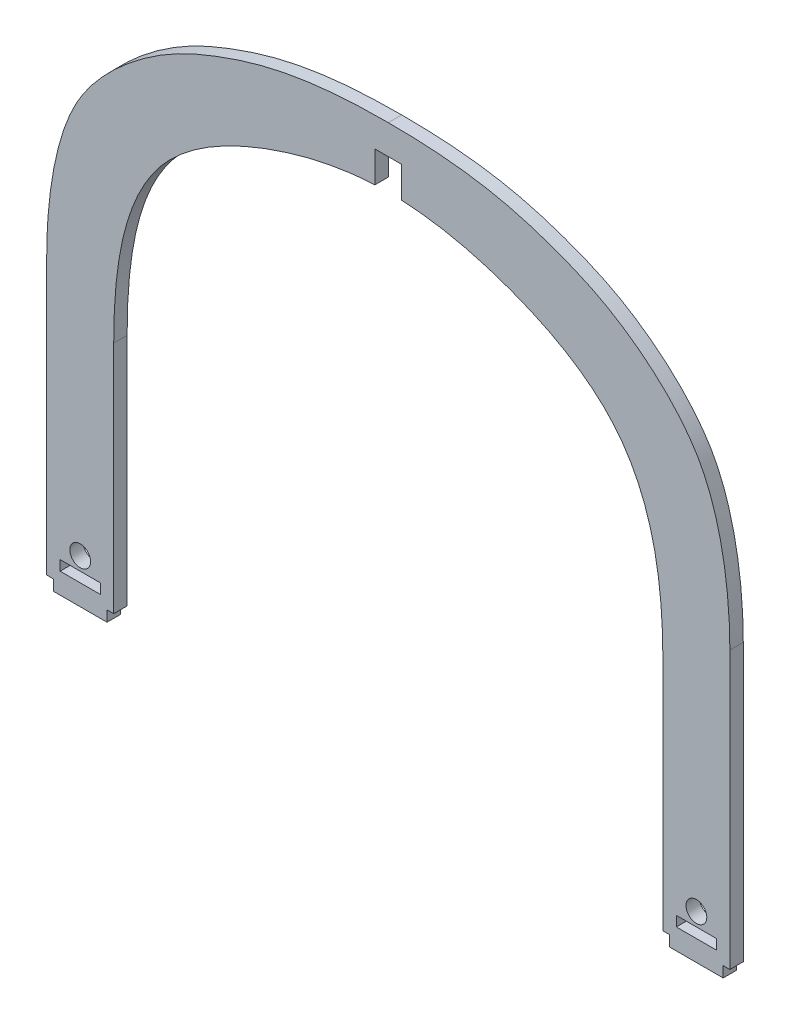
ISO-10303-21;
HEADER;
FILE_DESCRIPTION(('STEP AP214'),'2;1');
FILE_NAME('part.step','',(''),(''),'','','');
FILE_SCHEMA(('AUTOMOTIVE_DESIGN { 1 0 10303 214 1 1 1 1 }'));
ENDSEC;
DATA;
#1=APPLICATION_CONTEXT('core data for automotive mechanical design processes');
#2=APPLICATION_PROTOCOL_DEFINITION('international standard','automotive_design',2000,#1);
#3=PRODUCT_CONTEXT('',#1,'mechanical');
#4=PRODUCT('Part','Part','',(#3));
#5=PRODUCT_RELATED_PRODUCT_CATEGORY('part','',(#4));
#6=PRODUCT_DEFINITION_FORMATION('','',#4);
#7=PRODUCT_DEFINITION_CONTEXT('part definition',#1,'design');
#8=PRODUCT_DEFINITION('design','',#6,#7);
#9=PRODUCT_DEFINITION_SHAPE('','',#8);
#10=(LENGTH_UNIT() NAMED_UNIT(*) SI_UNIT(.MILLI.,.METRE.));
#11=(NAMED_UNIT(*) PLANE_ANGLE_UNIT() SI_UNIT($,.RADIAN.));
#12=(NAMED_UNIT(*) SI_UNIT($,.STERADIAN.) SOLID_ANGLE_UNIT());
#13=UNCERTAINTY_MEASURE_WITH_UNIT(LENGTH_MEASURE(1.E-05),#10,'distance_accuracy_value','');
#14=(GEOMETRIC_REPRESENTATION_CONTEXT(3) GLOBAL_UNCERTAINTY_ASSIGNED_CONTEXT((#13)) GLOBAL_UNIT_ASSIGNED_CONTEXT((#10,
#11,#12)) REPRESENTATION_CONTEXT('',''));
#15=CARTESIAN_POINT('',(0.,0.,0.));
#16=DIRECTION('',(0.,0.,1.));
#17=DIRECTION('',(1.,0.,0.));
#18=AXIS2_PLACEMENT_3D('',#15,#16,#17);
#19=CARTESIAN_POINT('',(0.,0.,2.));
#20=DIRECTION('',(1.,0.,0.));
#21=DIRECTION('',(0.,0.,-1.));
#22=AXIS2_PLACEMENT_3D('',#19,#20,#21);
#23=PLANE('',#22);
#24=DIRECTION('',(0.,-1.,0.));
#25=VECTOR('',#24,1.);
#26=CARTESIAN_POINT('',(0.,0.,0.));
#27=LINE('',#26,#25);
#28=CARTESIAN_POINT('',(0.,41.3187023405494,0.));
#29=VERTEX_POINT('',#28);
#30=CARTESIAN_POINT('',(0.,0.,0.));
#31=VERTEX_POINT('',#30);
#32=EDGE_CURVE('E334',#29,#31,#27,.T.);
#33=ORIENTED_EDGE('',*,*,#32,.T.);
#34=DIRECTION('',(0.,0.,-1.));
#35=VECTOR('',#34,1.);
#36=CARTESIAN_POINT('',(0.,0.,2.));
#37=LINE('',#36,#35);
#38=CARTESIAN_POINT('',(0.,0.,2.));
#39=VERTEX_POINT('',#38);
#40=EDGE_CURVE('E44',#39,#31,#37,.T.);
#41=ORIENTED_EDGE('',*,*,#40,.F.);
#42=DIRECTION('',(0.,-1.,0.));
#43=VECTOR('',#42,1.);
#44=CARTESIAN_POINT('',(0.,0.,2.));
#45=LINE('',#44,#43);
#46=CARTESIAN_POINT('',(0.,41.3187023405494,2.));
#47=VERTEX_POINT('',#46);
#48=EDGE_CURVE('E335',#47,#39,#45,.T.);
#49=ORIENTED_EDGE('',*,*,#48,.F.);
#50=DIRECTION('',(0.,0.,-1.));
#51=VECTOR('',#50,1.);
#52=CARTESIAN_POINT('',(0.,41.3187023405494,2.));
#53=LINE('',#52,#51);
#54=EDGE_CURVE('E470',#47,#29,#53,.T.);
#55=ORIENTED_EDGE('',*,*,#54,.T.);
#56=EDGE_LOOP('',(#33,#41,#49,#55));
#57=FACE_BOUND('',#56,.T.);
#58=ADVANCED_FACE('F37',(#57),#23,.F.);
#59=CARTESIAN_POINT('',(0.,0.,2.));
#60=DIRECTION('',(0.,1.,0.));
#61=DIRECTION('',(0.,0.,1.));
#62=AXIS2_PLACEMENT_3D('',#59,#60,#61);
#63=PLANE('',#62);
#64=DIRECTION('',(1.,0.,0.));
#65=VECTOR('',#64,1.);
#66=CARTESIAN_POINT('',(0.,0.,0.));
#67=LINE('',#66,#65);
#68=CARTESIAN_POINT('',(0.999999999999987,0.,0.));
#69=VERTEX_POINT('',#68);
#70=EDGE_CURVE('E401',#31,#69,#67,.T.);
#71=ORIENTED_EDGE('',*,*,#70,.T.);
#72=DIRECTION('',(0.,0.,-1.));
#73=VECTOR('',#72,1.);
#74=CARTESIAN_POINT('',(0.999999999999987,0.,2.));
#75=LINE('',#74,#73);
#76=CARTESIAN_POINT('',(0.999999999999987,0.,2.));
#77=VERTEX_POINT('',#76);
#78=EDGE_CURVE('E403',#77,#69,#75,.T.);
#79=ORIENTED_EDGE('',*,*,#78,.F.);
#80=DIRECTION('',(1.,0.,0.));
#81=VECTOR('',#80,1.);
#82=CARTESIAN_POINT('',(0.,0.,2.));
#83=LINE('',#82,#81);
#84=EDGE_CURVE('E338',#39,#77,#83,.T.);
#85=ORIENTED_EDGE('',*,*,#84,.F.);
#86=ORIENTED_EDGE('',*,*,#40,.T.);
#87=EDGE_LOOP('',(#71,#79,#85,#86));
#88=FACE_BOUND('',#87,.T.);
#89=ADVANCED_FACE('F391',(#88),#63,.F.);
#90=CARTESIAN_POINT('',(0.999999999999987,-1.6,2.));
#91=DIRECTION('',(1.,0.,0.));
#92=DIRECTION('',(0.,0.,-1.));
#93=AXIS2_PLACEMENT_3D('',#90,#91,#92);
#94=PLANE('',#93);
#95=DIRECTION('',(0.,-1.,0.));
#96=VECTOR('',#95,1.);
#97=CARTESIAN_POINT('',(0.999999999999987,-1.6,0.));
#98=LINE('',#97,#96);
#99=CARTESIAN_POINT('',(0.999999999999987,-1.6,0.));
#100=VERTEX_POINT('',#99);
#101=EDGE_CURVE('E410',#69,#100,#98,.T.);
#102=ORIENTED_EDGE('',*,*,#101,.T.);
#103=DIRECTION('',(0.,0.,-1.));
#104=VECTOR('',#103,1.);
#105=CARTESIAN_POINT('',(0.999999999999987,-1.6,2.));
#106=LINE('',#105,#104);
#107=CARTESIAN_POINT('',(0.999999999999987,-1.6,2.));
#108=VERTEX_POINT('',#107);
#109=EDGE_CURVE('E414',#108,#100,#106,.T.);
#110=ORIENTED_EDGE('',*,*,#109,.F.);
#111=DIRECTION('',(0.,-1.,0.));
#112=VECTOR('',#111,1.);
#113=CARTESIAN_POINT('',(0.999999999999987,-1.6,2.));
#114=LINE('',#113,#112);
#115=EDGE_CURVE('E341',#77,#108,#114,.T.);
#116=ORIENTED_EDGE('',*,*,#115,.F.);
#117=ORIENTED_EDGE('',*,*,#78,.T.);
#118=EDGE_LOOP('',(#102,#110,#116,#117));
#119=FACE_BOUND('',#118,.T.);
#120=ADVANCED_FACE('F388',(#119),#94,.F.);
#121=CARTESIAN_POINT('',(8.99999999999999,-1.6,2.));
#122=DIRECTION('',(0.,1.,0.));
#123=DIRECTION('',(0.,0.,1.));
#124=AXIS2_PLACEMENT_3D('',#121,#122,#123);
#125=PLANE('',#124);
#126=DIRECTION('',(1.,0.,0.));
#127=VECTOR('',#126,1.);
#128=CARTESIAN_POINT('',(8.99999999999999,-1.6,0.));
#129=LINE('',#128,#127);
#130=CARTESIAN_POINT('',(8.99999999999999,-1.6,0.));
#131=VERTEX_POINT('',#130);
#132=EDGE_CURVE('E420',#100,#131,#129,.T.);
#133=ORIENTED_EDGE('',*,*,#132,.T.);
#134=DIRECTION('',(0.,0.,-1.));
#135=VECTOR('',#134,1.);
#136=CARTESIAN_POINT('',(8.99999999999999,-1.6,2.));
#137=LINE('',#136,#135);
#138=CARTESIAN_POINT('',(8.99999999999999,-1.6,2.));
#139=VERTEX_POINT('',#138);
#140=EDGE_CURVE('E513',#139,#131,#137,.T.);
#141=ORIENTED_EDGE('',*,*,#140,.F.);
#142=DIRECTION('',(1.,0.,0.));
#143=VECTOR('',#142,1.);
#144=CARTESIAN_POINT('',(8.99999999999999,-1.6,2.));
#145=LINE('',#144,#143);
#146=EDGE_CURVE('E343',#108,#139,#145,.T.);
#147=ORIENTED_EDGE('',*,*,#146,.F.);
#148=ORIENTED_EDGE('',*,*,#109,.T.);
#149=EDGE_LOOP('',(#133,#141,#147,#148));
#150=FACE_BOUND('',#149,.T.);
#151=ADVANCED_FACE('F384',(#150),#125,.F.);
#152=CARTESIAN_POINT('',(8.99999999999999,-1.6,2.));
#153=DIRECTION('',(-1.,0.,0.));
#154=DIRECTION('',(0.,0.,1.));
#155=AXIS2_PLACEMENT_3D('',#152,#153,#154);
#156=PLANE('',#155);
#157=DIRECTION('',(0.,1.,0.));
#158=VECTOR('',#157,1.);
#159=CARTESIAN_POINT('',(8.99999999999999,-1.6,0.));
#160=LINE('',#159,#158);
#161=CARTESIAN_POINT('',(8.99999999999999,0.,0.));
#162=VERTEX_POINT('',#161);
#163=EDGE_CURVE('E422',#131,#162,#160,.T.);
#164=ORIENTED_EDGE('',*,*,#163,.T.);
#165=DIRECTION('',(0.,0.,-1.));
#166=VECTOR('',#165,1.);
#167=CARTESIAN_POINT('',(8.99999999999999,0.,2.));
#168=LINE('',#167,#166);
#169=CARTESIAN_POINT('',(8.99999999999999,0.,2.));
#170=VERTEX_POINT('',#169);
#171=EDGE_CURVE('E510',#170,#162,#168,.T.);
#172=ORIENTED_EDGE('',*,*,#171,.F.);
#173=DIRECTION('',(0.,1.,0.));
#174=VECTOR('',#173,1.);
#175=CARTESIAN_POINT('',(8.99999999999999,-1.6,2.));
#176=LINE('',#175,#174);
#177=EDGE_CURVE('E345',#139,#170,#176,.T.);
#178=ORIENTED_EDGE('',*,*,#177,.F.);
#179=ORIENTED_EDGE('',*,*,#140,.T.);
#180=EDGE_LOOP('',(#164,#172,#178,#179));
#181=FACE_BOUND('',#180,.T.);
#182=ADVANCED_FACE('F380',(#181),#156,.F.);
#183=CARTESIAN_POINT('',(8.99999999999999,0.,2.));
#184=DIRECTION('',(0.,1.,0.));
#185=DIRECTION('',(0.,0.,1.));
#186=AXIS2_PLACEMENT_3D('',#183,#184,#185);
#187=PLANE('',#186);
#188=DIRECTION('',(1.,0.,0.));
#189=VECTOR('',#188,1.);
#190=CARTESIAN_POINT('',(8.99999999999999,0.,0.));
#191=LINE('',#190,#189);
#192=CARTESIAN_POINT('',(10.,0.,0.));
#193=VERTEX_POINT('',#192);
#194=EDGE_CURVE('E427',#162,#193,#191,.T.);
#195=ORIENTED_EDGE('',*,*,#194,.T.);
#196=DIRECTION('',(0.,0.,-1.));
#197=VECTOR('',#196,1.);
#198=CARTESIAN_POINT('',(10.,0.,2.));
#199=LINE('',#198,#197);
#200=CARTESIAN_POINT('',(10.,0.,2.));
#201=VERTEX_POINT('',#200);
#202=EDGE_CURVE('E507',#201,#193,#199,.T.);
#203=ORIENTED_EDGE('',*,*,#202,.F.);
#204=DIRECTION('',(1.,0.,0.));
#205=VECTOR('',#204,1.);
#206=CARTESIAN_POINT('',(8.99999999999999,0.,2.));
#207=LINE('',#206,#205);
#208=EDGE_CURVE('E347',#170,#201,#207,.T.);
#209=ORIENTED_EDGE('',*,*,#208,.F.);
#210=ORIENTED_EDGE('',*,*,#171,.T.);
#211=EDGE_LOOP('',(#195,#203,#209,#210));
#212=FACE_BOUND('',#211,.T.);
#213=ADVANCED_FACE('F376',(#212),#187,.F.);
#214=CARTESIAN_POINT('',(10.,0.,2.));
#215=DIRECTION('',(-1.,0.,0.));
#216=DIRECTION('',(0.,0.,1.));
#217=AXIS2_PLACEMENT_3D('',#214,#215,#216);
#218=PLANE('',#217);
#219=DIRECTION('',(0.,1.,0.));
#220=VECTOR('',#219,1.);
#221=CARTESIAN_POINT('',(10.,0.,0.));
#222=LINE('',#221,#220);
#223=CARTESIAN_POINT('',(10.,35.,0.));
#224=VERTEX_POINT('',#223);
#225=EDGE_CURVE('E429',#193,#224,#222,.T.);
#226=ORIENTED_EDGE('',*,*,#225,.T.);
#227=DIRECTION('',(0.,0.,-1.));
#228=VECTOR('',#227,1.);
#229=CARTESIAN_POINT('',(10.,35.,2.));
#230=LINE('',#229,#228);
#231=CARTESIAN_POINT('',(10.,35.,2.));
#232=VERTEX_POINT('',#231);
#233=EDGE_CURVE('E504',#232,#224,#230,.T.);
#234=ORIENTED_EDGE('',*,*,#233,.F.);
#235=DIRECTION('',(0.,1.,0.));
#236=VECTOR('',#235,1.);
#237=CARTESIAN_POINT('',(10.,0.,2.));
#238=LINE('',#237,#236);
#239=EDGE_CURVE('E349',#201,#232,#238,.T.);
#240=ORIENTED_EDGE('',*,*,#239,.F.);
#241=ORIENTED_EDGE('',*,*,#202,.T.);
#242=EDGE_LOOP('',(#226,#234,#240,#241));
#243=FACE_BOUND('',#242,.T.);
#244=ADVANCED_FACE('F371',(#243),#218,.F.);
#245=CARTESIAN_POINT('',(10.,35.,2.));
#246=CARTESIAN_POINT('',(10.,45.9589332291043,2.));
#247=CARTESIAN_POINT('',(12.8021059266656,61.850376918426,2.));
#248=CARTESIAN_POINT('',(33.1389714038435,72.6057743338403,2.));
#249=CARTESIAN_POINT('',(45.150309794181,75.0000000000001,2.));
#250=CARTESIAN_POINT('',(51.,75.,2.));
#251=B_SPLINE_CURVE_WITH_KNOTS('',3,(#245,#246,#247,#248,#249,#250),.UNSPECIFIED.,.F.,.F.,(4,1,
1,4),(0.,0.441101429852636,0.72166621567052,1.),.UNSPECIFIED.);
#252=DIRECTION('',(0.,0.,-1.));
#253=VECTOR('',#252,1.);
#254=SURFACE_OF_LINEAR_EXTRUSION('',#251,#253);
#255=CARTESIAN_POINT('',(10.,35.,0.));
#256=CARTESIAN_POINT('',(10.,45.9589332291043,0.));
#257=CARTESIAN_POINT('',(12.8021059266656,61.850376918426,0.));
#258=CARTESIAN_POINT('',(33.1389714038435,72.6057743338403,0.));
#259=CARTESIAN_POINT('',(45.150309794181,75.0000000000001,0.));
#260=CARTESIAN_POINT('',(51.,75.,0.));
#261=B_SPLINE_CURVE_WITH_KNOTS('',3,(#255,#256,#257,#258,#259,#260),.UNSPECIFIED.,.F.,.F.,(4,1,
1,4),(0.,0.441101429852636,0.72166621567052,1.),.UNSPECIFIED.);
#262=CARTESIAN_POINT('',(49.0000000000001,74.9541925724337,0.));
#263=VERTEX_POINT('',#262);
#264=EDGE_CURVE('E431',#224,#263,#261,.T.);
#265=ORIENTED_EDGE('',*,*,#264,.T.);
#266=DIRECTION('',(0.,0.,-1.));
#267=VECTOR('',#266,1.);
#268=CARTESIAN_POINT('',(49.0000000000009,74.9541925724338,2.));
#269=LINE('',#268,#267);
#270=CARTESIAN_POINT('',(49.,74.9541925724337,2.));
#271=VERTEX_POINT('',#270);
#272=EDGE_CURVE('E326',#263,#271,#269,.F.);
#273=ORIENTED_EDGE('',*,*,#272,.T.);
#274=EDGE_CURVE('E351',#232,#271,#251,.T.);
#275=ORIENTED_EDGE('',*,*,#274,.F.);
#276=ORIENTED_EDGE('',*,*,#233,.T.);
#277=EDGE_LOOP('',(#265,#273,#275,#276));
#278=FACE_BOUND('',#277,.T.);
#279=ADVANCED_FACE('F366',(#278),#254,.F.);
#280=CARTESIAN_POINT('',(51.,75.,2.));
#281=CARTESIAN_POINT('',(56.849690205819,75.0000000000001,2.));
#282=CARTESIAN_POINT('',(68.8610285961565,72.6057743338403,2.));
#283=CARTESIAN_POINT('',(89.1978940733344,61.850376918426,2.));
#284=CARTESIAN_POINT('',(91.9999999999999,45.9589332291043,2.));
#285=CARTESIAN_POINT('',(92.,35.,2.));
#286=B_SPLINE_CURVE_WITH_KNOTS('',3,(#280,#281,#282,#283,#284,#285),.UNSPECIFIED.,.F.,.F.,(4,1,
1,4),(0.,0.27833378432948,0.558898570147365,1.),.UNSPECIFIED.);
#287=DIRECTION('',(0.,0.,-1.));
#288=VECTOR('',#287,1.);
#289=SURFACE_OF_LINEAR_EXTRUSION('',#286,#288);
#290=CARTESIAN_POINT('',(53.,74.9541925724337,2.));
#291=VERTEX_POINT('',#290);
#292=CARTESIAN_POINT('',(92.,35.,2.));
#293=VERTEX_POINT('',#292);
#294=EDGE_CURVE('E357',#291,#293,#286,.T.);
#295=ORIENTED_EDGE('',*,*,#294,.F.);
#296=DIRECTION('',(0.,0.,-1.));
#297=VECTOR('',#296,1.);
#298=CARTESIAN_POINT('',(53.,74.9541925724337,2.));
#299=LINE('',#298,#297);
#300=CARTESIAN_POINT('',(53.,74.9541925724337,0.));
#301=VERTEX_POINT('',#300);
#302=EDGE_CURVE('E331',#291,#301,#299,.T.);
#303=ORIENTED_EDGE('',*,*,#302,.T.);
#304=CARTESIAN_POINT('',(51.,75.,0.));
#305=CARTESIAN_POINT('',(56.849690205819,75.0000000000001,0.));
#306=CARTESIAN_POINT('',(68.8610285961565,72.6057743338403,0.));
#307=CARTESIAN_POINT('',(89.1978940733344,61.850376918426,0.));
#308=CARTESIAN_POINT('',(91.9999999999999,45.9589332291043,0.));
#309=CARTESIAN_POINT('',(92.,35.,0.));
#310=B_SPLINE_CURVE_WITH_KNOTS('',3,(#304,#305,#306,#307,#308,#309),.UNSPECIFIED.,.F.,.F.,(4,1,
1,4),(0.,0.27833378432948,0.558898570147365,1.),.UNSPECIFIED.);
#311=CARTESIAN_POINT('',(92.,35.,0.));
#312=VERTEX_POINT('',#311);
#313=EDGE_CURVE('E436',#301,#312,#310,.T.);
#314=ORIENTED_EDGE('',*,*,#313,.T.);
#315=DIRECTION('',(0.,0.,-1.));
#316=VECTOR('',#315,1.);
#317=CARTESIAN_POINT('',(92.,35.,2.));
#318=LINE('',#317,#316);
#319=EDGE_CURVE('E501',#293,#312,#318,.T.);
#320=ORIENTED_EDGE('',*,*,#319,.F.);
#321=EDGE_LOOP('',(#295,#303,#314,#320));
#322=FACE_BOUND('',#321,.T.);
#323=ADVANCED_FACE('F370',(#322),#289,.F.);
#324=CARTESIAN_POINT('',(92.,35.,2.));
#325=DIRECTION('',(1.,0.,0.));
#326=DIRECTION('',(0.,1.,0.));
#327=AXIS2_PLACEMENT_3D('',#324,#325,#326);
#328=PLANE('',#327);
#329=DIRECTION('',(0.,-1.,0.));
#330=VECTOR('',#329,1.);
#331=CARTESIAN_POINT('',(92.,35.,0.));
#332=LINE('',#331,#330);
#333=CARTESIAN_POINT('',(92.,0.,0.));
#334=VERTEX_POINT('',#333);
#335=EDGE_CURVE('E443',#312,#334,#332,.T.);
#336=ORIENTED_EDGE('',*,*,#335,.T.);
#337=DIRECTION('',(0.,0.,-1.));
#338=VECTOR('',#337,1.);
#339=CARTESIAN_POINT('',(92.,0.,2.));
#340=LINE('',#339,#338);
#341=CARTESIAN_POINT('',(92.,0.,2.));
#342=VERTEX_POINT('',#341);
#343=EDGE_CURVE('E498',#342,#334,#340,.T.);
#344=ORIENTED_EDGE('',*,*,#343,.F.);
#345=DIRECTION('',(0.,-1.,0.));
#346=VECTOR('',#345,1.);
#347=CARTESIAN_POINT('',(92.,35.,2.));
#348=LINE('',#347,#346);
#349=EDGE_CURVE('E615',#293,#342,#348,.T.);
#350=ORIENTED_EDGE('',*,*,#349,.F.);
#351=ORIENTED_EDGE('',*,*,#319,.T.);
#352=EDGE_LOOP('',(#336,#344,#350,#351));
#353=FACE_BOUND('',#352,.T.);
#354=ADVANCED_FACE('F571',(#353),#328,.F.);
#355=CARTESIAN_POINT('',(92.,0.,2.));
#356=DIRECTION('',(0.,1.,0.));
#357=DIRECTION('',(0.,0.,1.));
#358=AXIS2_PLACEMENT_3D('',#355,#356,#357);
#359=PLANE('',#358);
#360=DIRECTION('',(1.,0.,0.));
#361=VECTOR('',#360,1.);
#362=CARTESIAN_POINT('',(92.,0.,0.));
#363=LINE('',#362,#361);
#364=CARTESIAN_POINT('',(93.,0.,0.));
#365=VERTEX_POINT('',#364);
#366=EDGE_CURVE('E448',#334,#365,#363,.T.);
#367=ORIENTED_EDGE('',*,*,#366,.T.);
#368=DIRECTION('',(0.,0.,-1.));
#369=VECTOR('',#368,1.);
#370=CARTESIAN_POINT('',(93.,0.,2.));
#371=LINE('',#370,#369);
#372=CARTESIAN_POINT('',(93.,0.,2.));
#373=VERTEX_POINT('',#372);
#374=EDGE_CURVE('E495',#373,#365,#371,.T.);
#375=ORIENTED_EDGE('',*,*,#374,.F.);
#376=DIRECTION('',(1.,0.,0.));
#377=VECTOR('',#376,1.);
#378=CARTESIAN_POINT('',(92.,0.,2.));
#379=LINE('',#378,#377);
#380=EDGE_CURVE('E586',#342,#373,#379,.T.);
#381=ORIENTED_EDGE('',*,*,#380,.F.);
#382=ORIENTED_EDGE('',*,*,#343,.T.);
#383=EDGE_LOOP('',(#367,#375,#381,#382));
#384=FACE_BOUND('',#383,.T.);
#385=ADVANCED_FACE('F568',(#384),#359,.F.);
#386=CARTESIAN_POINT('',(93.,-1.6,2.));
#387=DIRECTION('',(1.,0.,0.));
#388=DIRECTION('',(0.,0.,-1.));
#389=AXIS2_PLACEMENT_3D('',#386,#387,#388);
#390=PLANE('',#389);
#391=DIRECTION('',(0.,-1.,0.));
#392=VECTOR('',#391,1.);
#393=CARTESIAN_POINT('',(93.,-1.6,0.));
#394=LINE('',#393,#392);
#395=CARTESIAN_POINT('',(93.,-1.6,0.));
#396=VERTEX_POINT('',#395);
#397=EDGE_CURVE('E450',#365,#396,#394,.T.);
#398=ORIENTED_EDGE('',*,*,#397,.T.);
#399=DIRECTION('',(0.,0.,-1.));
#400=VECTOR('',#399,1.);
#401=CARTESIAN_POINT('',(93.,-1.6,2.));
#402=LINE('',#401,#400);
#403=CARTESIAN_POINT('',(93.,-1.6,2.));
#404=VERTEX_POINT('',#403);
#405=EDGE_CURVE('E492',#404,#396,#402,.T.);
#406=ORIENTED_EDGE('',*,*,#405,.F.);
#407=DIRECTION('',(0.,-1.,0.));
#408=VECTOR('',#407,1.);
#409=CARTESIAN_POINT('',(93.,-1.6,2.));
#410=LINE('',#409,#408);
#411=EDGE_CURVE('E597',#373,#404,#410,.T.);
#412=ORIENTED_EDGE('',*,*,#411,.F.);
#413=ORIENTED_EDGE('',*,*,#374,.T.);
#414=EDGE_LOOP('',(#398,#406,#412,#413));
#415=FACE_BOUND('',#414,.T.);
#416=ADVANCED_FACE('F564',(#415),#390,.F.);
#417=CARTESIAN_POINT('',(93.,-1.6,2.));
#418=DIRECTION('',(0.,1.,0.));
#419=DIRECTION('',(0.,0.,1.));
#420=AXIS2_PLACEMENT_3D('',#417,#418,#419);
#421=PLANE('',#420);
#422=DIRECTION('',(1.,0.,0.));
#423=VECTOR('',#422,1.);
#424=CARTESIAN_POINT('',(93.,-1.6,0.));
#425=LINE('',#424,#423);
#426=CARTESIAN_POINT('',(101.,-1.6,0.));
#427=VERTEX_POINT('',#426);
#428=EDGE_CURVE('E452',#396,#427,#425,.T.);
#429=ORIENTED_EDGE('',*,*,#428,.T.);
#430=DIRECTION('',(0.,0.,-1.));
#431=VECTOR('',#430,1.);
#432=CARTESIAN_POINT('',(101.,-1.6,2.));
#433=LINE('',#432,#431);
#434=CARTESIAN_POINT('',(101.,-1.6,2.));
#435=VERTEX_POINT('',#434);
#436=EDGE_CURVE('E489',#435,#427,#433,.T.);
#437=ORIENTED_EDGE('',*,*,#436,.F.);
#438=DIRECTION('',(1.,0.,0.));
#439=VECTOR('',#438,1.);
#440=CARTESIAN_POINT('',(93.,-1.6,2.));
#441=LINE('',#440,#439);
#442=EDGE_CURVE('E594',#404,#435,#441,.T.);
#443=ORIENTED_EDGE('',*,*,#442,.F.);
#444=ORIENTED_EDGE('',*,*,#405,.T.);
#445=EDGE_LOOP('',(#429,#437,#443,#444));
#446=FACE_BOUND('',#445,.T.);
#447=ADVANCED_FACE('F560',(#446),#421,.F.);
#448=CARTESIAN_POINT('',(101.,-1.6,2.));
#449=DIRECTION('',(-1.,0.,0.));
#450=DIRECTION('',(0.,0.,1.));
#451=AXIS2_PLACEMENT_3D('',#448,#449,#450);
#452=PLANE('',#451);
#453=DIRECTION('',(0.,1.,0.));
#454=VECTOR('',#453,1.);
#455=CARTESIAN_POINT('',(101.,-1.6,0.));
#456=LINE('',#455,#454);
#457=CARTESIAN_POINT('',(101.,0.,0.));
#458=VERTEX_POINT('',#457);
#459=EDGE_CURVE('E454',#427,#458,#456,.T.);
#460=ORIENTED_EDGE('',*,*,#459,.T.);
#461=DIRECTION('',(0.,0.,-1.));
#462=VECTOR('',#461,1.);
#463=CARTESIAN_POINT('',(101.,0.,2.));
#464=LINE('',#463,#462);
#465=CARTESIAN_POINT('',(101.,0.,2.));
#466=VERTEX_POINT('',#465);
#467=EDGE_CURVE('E486',#466,#458,#464,.T.);
#468=ORIENTED_EDGE('',*,*,#467,.F.);
#469=DIRECTION('',(0.,1.,0.));
#470=VECTOR('',#469,1.);
#471=CARTESIAN_POINT('',(101.,-1.6,2.));
#472=LINE('',#471,#470);
#473=EDGE_CURVE('E596',#435,#466,#472,.T.);
#474=ORIENTED_EDGE('',*,*,#473,.F.);
#475=ORIENTED_EDGE('',*,*,#436,.T.);
#476=EDGE_LOOP('',(#460,#468,#474,#475));
#477=FACE_BOUND('',#476,.T.);
#478=ADVANCED_FACE('F556',(#477),#452,.F.);
#479=CARTESIAN_POINT('',(101.,0.,2.));
#480=DIRECTION('',(0.,1.,0.));
#481=DIRECTION('',(0.,0.,1.));
#482=AXIS2_PLACEMENT_3D('',#479,#480,#481);
#483=PLANE('',#482);
#484=DIRECTION('',(1.,0.,0.));
#485=VECTOR('',#484,1.);
#486=CARTESIAN_POINT('',(101.,0.,0.));
#487=LINE('',#486,#485);
#488=CARTESIAN_POINT('',(102.,0.,0.));
#489=VERTEX_POINT('',#488);
#490=EDGE_CURVE('E456',#458,#489,#487,.T.);
#491=ORIENTED_EDGE('',*,*,#490,.T.);
#492=DIRECTION('',(0.,0.,-1.));
#493=VECTOR('',#492,1.);
#494=CARTESIAN_POINT('',(102.,0.,2.));
#495=LINE('',#494,#493);
#496=CARTESIAN_POINT('',(102.,0.,2.));
#497=VERTEX_POINT('',#496);
#498=EDGE_CURVE('E483',#497,#489,#495,.T.);
#499=ORIENTED_EDGE('',*,*,#498,.F.);
#500=DIRECTION('',(1.,0.,0.));
#501=VECTOR('',#500,1.);
#502=CARTESIAN_POINT('',(101.,0.,2.));
#503=LINE('',#502,#501);
#504=EDGE_CURVE('E599',#466,#497,#503,.T.);
#505=ORIENTED_EDGE('',*,*,#504,.F.);
#506=ORIENTED_EDGE('',*,*,#467,.T.);
#507=EDGE_LOOP('',(#491,#499,#505,#506));
#508=FACE_BOUND('',#507,.T.);
#509=ADVANCED_FACE('F552',(#508),#483,.F.);
#510=CARTESIAN_POINT('',(102.,0.,2.));
#511=DIRECTION('',(-1.,0.,0.));
#512=DIRECTION('',(0.,-1.,0.));
#513=AXIS2_PLACEMENT_3D('',#510,#511,#512);
#514=PLANE('',#513);
#515=DIRECTION('',(0.,1.,0.));
#516=VECTOR('',#515,1.);
#517=CARTESIAN_POINT('',(102.,0.,0.));
#518=LINE('',#517,#516);
#519=CARTESIAN_POINT('',(102.,41.3187023405494,0.));
#520=VERTEX_POINT('',#519);
#521=EDGE_CURVE('E458',#489,#520,#518,.T.);
#522=ORIENTED_EDGE('',*,*,#521,.T.);
#523=DIRECTION('',(0.,0.,-1.));
#524=VECTOR('',#523,1.);
#525=CARTESIAN_POINT('',(102.,41.3187023405494,2.));
#526=LINE('',#525,#524);
#527=CARTESIAN_POINT('',(102.,41.3187023405494,2.));
#528=VERTEX_POINT('',#527);
#529=EDGE_CURVE('E480',#528,#520,#526,.T.);
#530=ORIENTED_EDGE('',*,*,#529,.F.);
#531=DIRECTION('',(0.,1.,0.));
#532=VECTOR('',#531,1.);
#533=CARTESIAN_POINT('',(102.,0.,2.));
#534=LINE('',#533,#532);
#535=EDGE_CURVE('E604',#497,#528,#534,.T.);
#536=ORIENTED_EDGE('',*,*,#535,.F.);
#537=ORIENTED_EDGE('',*,*,#498,.T.);
#538=EDGE_LOOP('',(#522,#530,#536,#537));
#539=FACE_BOUND('',#538,.T.);
#540=ADVANCED_FACE('F548',(#539),#514,.F.);
#541=CARTESIAN_POINT('',(102.,41.3187023405494,2.));
#542=CARTESIAN_POINT('',(102.,48.3905761195159,2.));
#543=CARTESIAN_POINT('',(100.674869511675,58.8306988628621,2.));
#544=CARTESIAN_POINT('',(93.3281020768561,69.833438872415,2.));
#545=CARTESIAN_POINT('',(85.6023579202091,76.0793850670253,2.));
#546=CARTESIAN_POINT('',(71.2604452406079,82.0516073083705,2.));
#547=CARTESIAN_POINT('',(62.6387129042451,84.0000000000001,2.));
#548=CARTESIAN_POINT('',(50.9999999999999,84.,2.));
#549=B_SPLINE_CURVE_WITH_KNOTS('',3,(#541,#542,#543,#544,#545,#546,#547,#548),.UNSPECIFIED.,.F.,
.F.,(4,1,1,1,1,4),(0.,0.315306945891325,0.380759929780851,0.624110960104773,0.689076855005737,
1.),.UNSPECIFIED.);
#550=DIRECTION('',(0.,0.,-1.));
#551=VECTOR('',#550,1.);
#552=SURFACE_OF_LINEAR_EXTRUSION('',#549,#551);
#553=CARTESIAN_POINT('',(102.,41.3187023405494,0.));
#554=CARTESIAN_POINT('',(102.,48.3905761195159,0.));
#555=CARTESIAN_POINT('',(100.674869511675,58.8306988628621,0.));
#556=CARTESIAN_POINT('',(93.3281020768561,69.833438872415,0.));
#557=CARTESIAN_POINT('',(85.6023579202091,76.0793850670253,0.));
#558=CARTESIAN_POINT('',(71.2604452406079,82.0516073083705,0.));
#559=CARTESIAN_POINT('',(62.6387129042451,84.0000000000001,0.));
#560=CARTESIAN_POINT('',(50.9999999999999,84.,0.));
#561=B_SPLINE_CURVE_WITH_KNOTS('',3,(#553,#554,#555,#556,#557,#558,#559,#560),.UNSPECIFIED.,.F.,
.F.,(4,1,1,1,1,4),(0.,0.315306945891325,0.380759929780851,0.624110960104773,0.689076855005737,
1.),.UNSPECIFIED.);
#562=CARTESIAN_POINT('',(50.9999999999999,84.,0.));
#563=VERTEX_POINT('',#562);
#564=EDGE_CURVE('E460',#520,#563,#561,.T.);
#565=ORIENTED_EDGE('',*,*,#564,.T.);
#566=DIRECTION('',(0.,0.,-1.));
#567=VECTOR('',#566,1.);
#568=CARTESIAN_POINT('',(50.9999999999999,84.,2.));
#569=LINE('',#568,#567);
#570=CARTESIAN_POINT('',(50.9999999999999,84.,2.));
#571=VERTEX_POINT('',#570);
#572=EDGE_CURVE('E476',#571,#563,#569,.T.);
#573=ORIENTED_EDGE('',*,*,#572,.F.);
#574=EDGE_CURVE('E530',#528,#571,#549,.T.);
#575=ORIENTED_EDGE('',*,*,#574,.F.);
#576=ORIENTED_EDGE('',*,*,#529,.T.);
#577=EDGE_LOOP('',(#565,#573,#575,#576));
#578=FACE_BOUND('',#577,.T.);
#579=ADVANCED_FACE('F543',(#578),#552,.F.);
#580=CARTESIAN_POINT('',(51.0000000000001,84.,2.));
#581=CARTESIAN_POINT('',(39.3612870957549,84.0000000000001,2.));
#582=CARTESIAN_POINT('',(30.7395547593921,82.0516073083705,2.));
#583=CARTESIAN_POINT('',(16.3976420797909,76.0793850670253,2.));
#584=CARTESIAN_POINT('',(8.67189792314387,69.833438872415,2.));
#585=CARTESIAN_POINT('',(1.32513048832462,58.8306988628621,2.));
#586=CARTESIAN_POINT('',(0.,48.3905761195159,2.));
#587=CARTESIAN_POINT('',(0.,41.3187023405494,2.));
#588=B_SPLINE_CURVE_WITH_KNOTS('',3,(#580,#581,#582,#583,#584,#585,#586,#587),.UNSPECIFIED.,.F.,
.F.,(4,1,1,1,1,4),(0.,0.310923144994263,0.375889039895227,0.619240070219149,0.684693054108675,
1.),.UNSPECIFIED.);
#589=DIRECTION('',(0.,0.,-1.));
#590=VECTOR('',#589,1.);
#591=SURFACE_OF_LINEAR_EXTRUSION('',#588,#590);
#592=CARTESIAN_POINT('',(51.0000000000001,84.,0.));
#593=CARTESIAN_POINT('',(39.3612870957549,84.0000000000001,0.));
#594=CARTESIAN_POINT('',(30.7395547593921,82.0516073083705,0.));
#595=CARTESIAN_POINT('',(16.3976420797909,76.0793850670253,0.));
#596=CARTESIAN_POINT('',(8.67189792314387,69.833438872415,0.));
#597=CARTESIAN_POINT('',(1.32513048832462,58.8306988628621,0.));
#598=CARTESIAN_POINT('',(0.,48.3905761195159,0.));
#599=CARTESIAN_POINT('',(0.,41.3187023405494,0.));
#600=B_SPLINE_CURVE_WITH_KNOTS('',3,(#592,#593,#594,#595,#596,#597,#598,#599),.UNSPECIFIED.,.F.,
.F.,(4,1,1,1,1,4),(0.,0.310923144994263,0.375889039895227,0.619240070219149,0.684693054108675,
1.),.UNSPECIFIED.);
#601=EDGE_CURVE('E339',#563,#29,#600,.T.);
#602=ORIENTED_EDGE('',*,*,#601,.T.);
#603=ORIENTED_EDGE('',*,*,#54,.F.);
#604=EDGE_CURVE('E477',#571,#47,#588,.T.);
#605=ORIENTED_EDGE('',*,*,#604,.F.);
#606=ORIENTED_EDGE('',*,*,#572,.T.);
#607=EDGE_LOOP('',(#602,#603,#605,#606));
#608=FACE_BOUND('',#607,.T.);
#609=ADVANCED_FACE('F539',(#608),#591,.F.);
#610=CARTESIAN_POINT('',(12.6714335856182,72.6553438480113,2.));
#611=DIRECTION('',(0.,0.,1.));
#612=DIRECTION('',(1.,0.,0.));
#613=AXIS2_PLACEMENT_3D('',#610,#611,#612);
#614=PLANE('',#613);
#615=DIRECTION('',(0.,-1.,0.));
#616=VECTOR('',#615,1.);
#617=CARTESIAN_POINT('',(100.,3.,2.));
#618=LINE('',#617,#616);
#619=CARTESIAN_POINT('',(100.,3.,2.));
#620=VERTEX_POINT('',#619);
#621=CARTESIAN_POINT('',(100.,1.5,2.));
#622=VERTEX_POINT('',#621);
#623=EDGE_CURVE('E231',#620,#622,#618,.T.);
#624=ORIENTED_EDGE('',*,*,#623,.T.);
#625=DIRECTION('',(-1.,0.,0.));
#626=VECTOR('',#625,1.);
#627=CARTESIAN_POINT('',(100.,1.5,2.));
#628=LINE('',#627,#626);
#629=CARTESIAN_POINT('',(94.,1.5,2.));
#630=VERTEX_POINT('',#629);
#631=EDGE_CURVE('E242',#622,#630,#628,.T.);
#632=ORIENTED_EDGE('',*,*,#631,.T.);
#633=DIRECTION('',(0.,1.,0.));
#634=VECTOR('',#633,1.);
#635=CARTESIAN_POINT('',(94.,1.5,2.));
#636=LINE('',#635,#634);
#637=CARTESIAN_POINT('',(94.,3.,2.));
#638=VERTEX_POINT('',#637);
#639=EDGE_CURVE('E51',#630,#638,#636,.T.);
#640=ORIENTED_EDGE('',*,*,#639,.T.);
#641=DIRECTION('',(1.,0.,0.));
#642=VECTOR('',#641,1.);
#643=CARTESIAN_POINT('',(94.,3.,2.));
#644=LINE('',#643,#642);
#645=EDGE_CURVE('E239',#638,#620,#644,.T.);
#646=ORIENTED_EDGE('',*,*,#645,.T.);
#647=EDGE_LOOP('',(#624,#632,#640,#646));
#648=FACE_BOUND('',#647,.T.);
#649=DIRECTION('',(-1.,0.,0.));
#650=VECTOR('',#649,1.);
#651=CARTESIAN_POINT('',(1.99999999999999,1.5,2.));
#652=LINE('',#651,#650);
#653=CARTESIAN_POINT('',(7.99999999999999,1.5,2.));
#654=VERTEX_POINT('',#653);
#655=CARTESIAN_POINT('',(1.99999999999999,1.5,2.));
#656=VERTEX_POINT('',#655);
#657=EDGE_CURVE('E269',#654,#656,#652,.T.);
#658=ORIENTED_EDGE('',*,*,#657,.T.);
#659=DIRECTION('',(0.,1.,0.));
#660=VECTOR('',#659,1.);
#661=CARTESIAN_POINT('',(1.99999999999999,3.,2.));
#662=LINE('',#661,#660);
#663=CARTESIAN_POINT('',(1.99999999999999,3.,2.));
#664=VERTEX_POINT('',#663);
#665=EDGE_CURVE('E272',#656,#664,#662,.T.);
#666=ORIENTED_EDGE('',*,*,#665,.T.);
#667=DIRECTION('',(1.,0.,0.));
#668=VECTOR('',#667,1.);
#669=CARTESIAN_POINT('',(7.99999999999999,3.,2.));
#670=LINE('',#669,#668);
#671=CARTESIAN_POINT('',(7.99999999999999,3.,2.));
#672=VERTEX_POINT('',#671);
#673=EDGE_CURVE('E59',#664,#672,#670,.T.);
#674=ORIENTED_EDGE('',*,*,#673,.T.);
#675=DIRECTION('',(0.,-1.,0.));
#676=VECTOR('',#675,1.);
#677=CARTESIAN_POINT('',(7.99999999999999,1.5,2.));
#678=LINE('',#677,#676);
#679=EDGE_CURVE('E277',#672,#654,#678,.T.);
#680=ORIENTED_EDGE('',*,*,#679,.T.);
#681=EDGE_LOOP('',(#658,#666,#674,#680));
#682=FACE_BOUND('',#681,.T.);
#683=CARTESIAN_POINT('',(97.,5.,2.));
#684=DIRECTION('',(0.,0.,-1.));
#685=DIRECTION('',(-1.,0.,0.));
#686=AXIS2_PLACEMENT_3D('',#683,#684,#685);
#687=CIRCLE('',#686,1.54999999999999);
#688=CARTESIAN_POINT('',(95.45,5.,2.));
#689=VERTEX_POINT('',#688);
#690=EDGE_CURVE('E298',#689,#689,#687,.T.);
#691=ORIENTED_EDGE('',*,*,#690,.T.);
#692=EDGE_LOOP('',(#691));
#693=FACE_BOUND('',#692,.T.);
#694=CARTESIAN_POINT('',(4.99999999999999,5.00000000000001,2.));
#695=DIRECTION('',(0.,0.,-1.));
#696=DIRECTION('',(1.,0.,0.));
#697=AXIS2_PLACEMENT_3D('',#694,#695,#696);
#698=CIRCLE('',#697,1.54999999999999);
#699=CARTESIAN_POINT('',(6.54999999999998,5.00000000000001,2.));
#700=VERTEX_POINT('',#699);
#701=EDGE_CURVE('E305',#700,#700,#698,.T.);
#702=ORIENTED_EDGE('',*,*,#701,.T.);
#703=EDGE_LOOP('',(#702));
#704=FACE_BOUND('',#703,.T.);
#705=DIRECTION('',(0.,-1.,0.));
#706=VECTOR('',#705,1.);
#707=CARTESIAN_POINT('',(53.,79.6,2.));
#708=LINE('',#707,#706);
#709=CARTESIAN_POINT('',(53.,79.6,2.));
#710=VERTEX_POINT('',#709);
#711=EDGE_CURVE('E310',#710,#291,#708,.T.);
#712=ORIENTED_EDGE('',*,*,#711,.T.);
#713=ORIENTED_EDGE('',*,*,#294,.T.);
#714=ORIENTED_EDGE('',*,*,#349,.T.);
#715=ORIENTED_EDGE('',*,*,#380,.T.);
#716=ORIENTED_EDGE('',*,*,#411,.T.);
#717=ORIENTED_EDGE('',*,*,#442,.T.);
#718=ORIENTED_EDGE('',*,*,#473,.T.);
#719=ORIENTED_EDGE('',*,*,#504,.T.);
#720=ORIENTED_EDGE('',*,*,#535,.T.);
#721=ORIENTED_EDGE('',*,*,#574,.T.);
#722=ORIENTED_EDGE('',*,*,#604,.T.);
#723=ORIENTED_EDGE('',*,*,#48,.T.);
#724=ORIENTED_EDGE('',*,*,#84,.T.);
#725=ORIENTED_EDGE('',*,*,#115,.T.);
#726=ORIENTED_EDGE('',*,*,#146,.T.);
#727=ORIENTED_EDGE('',*,*,#177,.T.);
#728=ORIENTED_EDGE('',*,*,#208,.T.);
#729=ORIENTED_EDGE('',*,*,#239,.T.);
#730=ORIENTED_EDGE('',*,*,#274,.T.);
#731=DIRECTION('',(0.,1.,0.));
#732=VECTOR('',#731,1.);
#733=CARTESIAN_POINT('',(49.,73.,2.));
#734=LINE('',#733,#732);
#735=CARTESIAN_POINT('',(49.,79.6,2.));
#736=VERTEX_POINT('',#735);
#737=EDGE_CURVE('E313',#271,#736,#734,.T.);
#738=ORIENTED_EDGE('',*,*,#737,.T.);
#739=DIRECTION('',(1.,0.,0.));
#740=VECTOR('',#739,1.);
#741=CARTESIAN_POINT('',(49.,79.6,2.));
#742=LINE('',#741,#740);
#743=EDGE_CURVE('E317',#736,#710,#742,.T.);
#744=ORIENTED_EDGE('',*,*,#743,.T.);
#745=EDGE_LOOP('',(#712,#713,#714,#715,#716,#717,#718,#719,#720,#721,#722,#723,#724,#725,#726,
#727,#728,#729,#730,#738,#744));
#746=FACE_BOUND('',#745,.T.);
#747=ADVANCED_FACE('F246',(#648,#682,#693,#704,#746),#614,.T.);
#748=CARTESIAN_POINT('',(12.6714335856182,72.6553438480113,0.));
#749=DIRECTION('',(0.,0.,1.));
#750=DIRECTION('',(1.,0.,0.));
#751=AXIS2_PLACEMENT_3D('',#748,#749,#750);
#752=PLANE('',#751);
#753=DIRECTION('',(-1.,0.,0.));
#754=VECTOR('',#753,1.);
#755=CARTESIAN_POINT('',(100.,1.5,0.));
#756=LINE('',#755,#754);
#757=CARTESIAN_POINT('',(100.,1.5,0.));
#758=VERTEX_POINT('',#757);
#759=CARTESIAN_POINT('',(94.,1.5,0.));
#760=VERTEX_POINT('',#759);
#761=EDGE_CURVE('E258',#758,#760,#756,.T.);
#762=ORIENTED_EDGE('',*,*,#761,.F.);
#763=DIRECTION('',(0.,-1.,0.));
#764=VECTOR('',#763,1.);
#765=CARTESIAN_POINT('',(100.,3.,0.));
#766=LINE('',#765,#764);
#767=CARTESIAN_POINT('',(100.,3.,0.));
#768=VERTEX_POINT('',#767);
#769=EDGE_CURVE('E234',#768,#758,#766,.T.);
#770=ORIENTED_EDGE('',*,*,#769,.F.);
#771=DIRECTION('',(1.,0.,0.));
#772=VECTOR('',#771,1.);
#773=CARTESIAN_POINT('',(94.,3.,0.));
#774=LINE('',#773,#772);
#775=CARTESIAN_POINT('',(94.,3.,0.));
#776=VERTEX_POINT('',#775);
#777=EDGE_CURVE('E249',#776,#768,#774,.T.);
#778=ORIENTED_EDGE('',*,*,#777,.F.);
#779=DIRECTION('',(0.,1.,0.));
#780=VECTOR('',#779,1.);
#781=CARTESIAN_POINT('',(94.,1.5,0.));
#782=LINE('',#781,#780);
#783=EDGE_CURVE('E252',#760,#776,#782,.T.);
#784=ORIENTED_EDGE('',*,*,#783,.F.);
#785=EDGE_LOOP('',(#762,#770,#778,#784));
#786=FACE_BOUND('',#785,.T.);
#787=DIRECTION('',(0.,1.,0.));
#788=VECTOR('',#787,1.);
#789=CARTESIAN_POINT('',(1.99999999999999,3.,0.));
#790=LINE('',#789,#788);
#791=CARTESIAN_POINT('',(1.99999999999999,1.5,0.));
#792=VERTEX_POINT('',#791);
#793=CARTESIAN_POINT('',(1.99999999999999,3.,0.));
#794=VERTEX_POINT('',#793);
#795=EDGE_CURVE('E283',#792,#794,#790,.T.);
#796=ORIENTED_EDGE('',*,*,#795,.F.);
#797=DIRECTION('',(-1.,0.,0.));
#798=VECTOR('',#797,1.);
#799=CARTESIAN_POINT('',(1.99999999999999,1.5,0.));
#800=LINE('',#799,#798);
#801=CARTESIAN_POINT('',(7.99999999999999,1.5,0.));
#802=VERTEX_POINT('',#801);
#803=EDGE_CURVE('E281',#802,#792,#800,.T.);
#804=ORIENTED_EDGE('',*,*,#803,.F.);
#805=DIRECTION('',(0.,-1.,0.));
#806=VECTOR('',#805,1.);
#807=CARTESIAN_POINT('',(7.99999999999999,1.5,0.));
#808=LINE('',#807,#806);
#809=CARTESIAN_POINT('',(7.99999999999999,3.,0.));
#810=VERTEX_POINT('',#809);
#811=EDGE_CURVE('E273',#810,#802,#808,.T.);
#812=ORIENTED_EDGE('',*,*,#811,.F.);
#813=DIRECTION('',(1.,0.,0.));
#814=VECTOR('',#813,1.);
#815=CARTESIAN_POINT('',(7.99999999999999,3.,0.));
#816=LINE('',#815,#814);
#817=EDGE_CURVE('E286',#794,#810,#816,.T.);
#818=ORIENTED_EDGE('',*,*,#817,.F.);
#819=EDGE_LOOP('',(#796,#804,#812,#818));
#820=FACE_BOUND('',#819,.T.);
#821=CARTESIAN_POINT('',(97.,5.,0.));
#822=DIRECTION('',(0.,0.,-1.));
#823=DIRECTION('',(-1.,0.,0.));
#824=AXIS2_PLACEMENT_3D('',#821,#822,#823);
#825=CIRCLE('',#824,1.54999999999999);
#826=CARTESIAN_POINT('',(95.45,5.,0.));
#827=VERTEX_POINT('',#826);
#828=EDGE_CURVE('E302',#827,#827,#825,.T.);
#829=ORIENTED_EDGE('',*,*,#828,.F.);
#830=EDGE_LOOP('',(#829));
#831=FACE_BOUND('',#830,.T.);
#832=CARTESIAN_POINT('',(4.99999999999999,5.00000000000001,0.));
#833=DIRECTION('',(0.,0.,-1.));
#834=DIRECTION('',(1.,0.,0.));
#835=AXIS2_PLACEMENT_3D('',#832,#833,#834);
#836=CIRCLE('',#835,1.54999999999999);
#837=CARTESIAN_POINT('',(6.54999999999998,5.00000000000001,0.));
#838=VERTEX_POINT('',#837);
#839=EDGE_CURVE('E265',#838,#838,#836,.T.);
#840=ORIENTED_EDGE('',*,*,#839,.F.);
#841=EDGE_LOOP('',(#840));
#842=FACE_BOUND('',#841,.T.);
#843=ORIENTED_EDGE('',*,*,#313,.F.);
#844=DIRECTION('',(0.,-1.,0.));
#845=VECTOR('',#844,1.);
#846=CARTESIAN_POINT('',(53.,79.6,0.));
#847=LINE('',#846,#845);
#848=CARTESIAN_POINT('',(53.,79.6,0.));
#849=VERTEX_POINT('',#848);
#850=EDGE_CURVE('E301',#849,#301,#847,.T.);
#851=ORIENTED_EDGE('',*,*,#850,.F.);
#852=DIRECTION('',(1.,0.,0.));
#853=VECTOR('',#852,1.);
#854=CARTESIAN_POINT('',(49.,79.6,0.));
#855=LINE('',#854,#853);
#856=CARTESIAN_POINT('',(49.,79.6,0.));
#857=VERTEX_POINT('',#856);
#858=EDGE_CURVE('E314',#857,#849,#855,.T.);
#859=ORIENTED_EDGE('',*,*,#858,.F.);
#860=DIRECTION('',(0.,-1.,0.));
#861=VECTOR('',#860,1.);
#862=CARTESIAN_POINT('',(49.,72.6553438480113,0.));
#863=LINE('',#862,#861);
#864=EDGE_CURVE('E11',#857,#263,#863,.T.);
#865=ORIENTED_EDGE('',*,*,#864,.T.);
#866=ORIENTED_EDGE('',*,*,#264,.F.);
#867=ORIENTED_EDGE('',*,*,#225,.F.);
#868=ORIENTED_EDGE('',*,*,#194,.F.);
#869=ORIENTED_EDGE('',*,*,#163,.F.);
#870=ORIENTED_EDGE('',*,*,#132,.F.);
#871=ORIENTED_EDGE('',*,*,#101,.F.);
#872=ORIENTED_EDGE('',*,*,#70,.F.);
#873=ORIENTED_EDGE('',*,*,#32,.F.);
#874=ORIENTED_EDGE('',*,*,#601,.F.);
#875=ORIENTED_EDGE('',*,*,#564,.F.);
#876=ORIENTED_EDGE('',*,*,#521,.F.);
#877=ORIENTED_EDGE('',*,*,#490,.F.);
#878=ORIENTED_EDGE('',*,*,#459,.F.);
#879=ORIENTED_EDGE('',*,*,#428,.F.);
#880=ORIENTED_EDGE('',*,*,#397,.F.);
#881=ORIENTED_EDGE('',*,*,#366,.F.);
#882=ORIENTED_EDGE('',*,*,#335,.F.);
#883=EDGE_LOOP('',(#843,#851,#859,#865,#866,#867,#868,#869,#870,#871,#872,#873,#874,#875,#876,
#877,#878,#879,#880,#881,#882));
#884=FACE_BOUND('',#883,.T.);
#885=ADVANCED_FACE('F418',(#786,#820,#831,#842,#884),#752,.F.);
#886=CARTESIAN_POINT('',(53.,79.6,2.));
#887=DIRECTION('',(1.,0.,0.));
#888=DIRECTION('',(0.,0.,-1.));
#889=AXIS2_PLACEMENT_3D('',#886,#887,#888);
#890=PLANE('',#889);
#891=ORIENTED_EDGE('',*,*,#711,.F.);
#892=DIRECTION('',(0.,0.,-1.));
#893=VECTOR('',#892,1.);
#894=CARTESIAN_POINT('',(53.,79.6,2.));
#895=LINE('',#894,#893);
#896=EDGE_CURVE('E324',#710,#849,#895,.T.);
#897=ORIENTED_EDGE('',*,*,#896,.T.);
#898=ORIENTED_EDGE('',*,*,#850,.T.);
#899=ORIENTED_EDGE('',*,*,#302,.F.);
#900=EDGE_LOOP('',(#891,#897,#898,#899));
#901=FACE_BOUND('',#900,.T.);
#902=ADVANCED_FACE('F621',(#901),#890,.F.);
#903=CARTESIAN_POINT('',(49.,73.,2.));
#904=DIRECTION('',(-1.,0.,0.));
#905=DIRECTION('',(0.,0.,1.));
#906=AXIS2_PLACEMENT_3D('',#903,#904,#905);
#907=PLANE('',#906);
#908=ORIENTED_EDGE('',*,*,#864,.F.);
#909=DIRECTION('',(0.,0.,-1.));
#910=VECTOR('',#909,1.);
#911=CARTESIAN_POINT('',(49.,79.6,2.));
#912=LINE('',#911,#910);
#913=EDGE_CURVE('E320',#736,#857,#912,.T.);
#914=ORIENTED_EDGE('',*,*,#913,.F.);
#915=ORIENTED_EDGE('',*,*,#737,.F.);
#916=ORIENTED_EDGE('',*,*,#272,.F.);
#917=EDGE_LOOP('',(#908,#914,#915,#916));
#918=FACE_BOUND('',#917,.T.);
#919=ADVANCED_FACE('F626',(#918),#907,.F.);
#920=CARTESIAN_POINT('',(49.,79.6,2.));
#921=DIRECTION('',(0.,1.,0.));
#922=DIRECTION('',(0.,0.,1.));
#923=AXIS2_PLACEMENT_3D('',#920,#921,#922);
#924=PLANE('',#923);
#925=ORIENTED_EDGE('',*,*,#858,.T.);
#926=ORIENTED_EDGE('',*,*,#896,.F.);
#927=ORIENTED_EDGE('',*,*,#743,.F.);
#928=ORIENTED_EDGE('',*,*,#913,.T.);
#929=EDGE_LOOP('',(#925,#926,#927,#928));
#930=FACE_BOUND('',#929,.T.);
#931=ADVANCED_FACE('F624',(#930),#924,.F.);
#932=CARTESIAN_POINT('',(4.99999999999999,5.00000000000001,2.));
#933=DIRECTION('',(0.,0.,-1.));
#934=DIRECTION('',(-1.,0.,0.));
#935=AXIS2_PLACEMENT_3D('',#932,#933,#934);
#936=CYLINDRICAL_SURFACE('',#935,1.54999999999999);
#937=ORIENTED_EDGE('',*,*,#701,.F.);
#938=EDGE_LOOP('',(#937));
#939=FACE_BOUND('',#938,.T.);
#940=ORIENTED_EDGE('',*,*,#839,.T.);
#941=EDGE_LOOP('',(#940));
#942=FACE_BOUND('',#941,.T.);
#943=ADVANCED_FACE('F641',(#939,#942),#936,.F.);
#944=CARTESIAN_POINT('',(97.,5.,2.));
#945=DIRECTION('',(0.,0.,-1.));
#946=DIRECTION('',(-1.,0.,0.));
#947=AXIS2_PLACEMENT_3D('',#944,#945,#946);
#948=CYLINDRICAL_SURFACE('',#947,1.54999999999999);
#949=ORIENTED_EDGE('',*,*,#690,.F.);
#950=EDGE_LOOP('',(#949));
#951=FACE_BOUND('',#950,.T.);
#952=ORIENTED_EDGE('',*,*,#828,.T.);
#953=EDGE_LOOP('',(#952));
#954=FACE_BOUND('',#953,.T.);
#955=ADVANCED_FACE('F663',(#951,#954),#948,.F.);
#956=CARTESIAN_POINT('',(1.99999999999999,1.5,2.));
#957=DIRECTION('',(0.,-1.,0.));
#958=DIRECTION('',(0.,0.,-1.));
#959=AXIS2_PLACEMENT_3D('',#956,#957,#958);
#960=PLANE('',#959);
#961=ORIENTED_EDGE('',*,*,#803,.T.);
#962=DIRECTION('',(0.,0.,-1.));
#963=VECTOR('',#962,1.);
#964=CARTESIAN_POINT('',(1.99999999999999,1.5,2.));
#965=LINE('',#964,#963);
#966=EDGE_CURVE('E280',#656,#792,#965,.T.);
#967=ORIENTED_EDGE('',*,*,#966,.F.);
#968=ORIENTED_EDGE('',*,*,#657,.F.);
#969=DIRECTION('',(0.,0.,-1.));
#970=VECTOR('',#969,1.);
#971=CARTESIAN_POINT('',(7.99999999999999,1.5,2.));
#972=LINE('',#971,#970);
#973=EDGE_CURVE('E259',#654,#802,#972,.T.);
#974=ORIENTED_EDGE('',*,*,#973,.T.);
#975=EDGE_LOOP('',(#961,#967,#968,#974));
#976=FACE_BOUND('',#975,.T.);
#977=ADVANCED_FACE('F668',(#976),#960,.F.);
#978=CARTESIAN_POINT('',(7.99999999999999,1.5,2.));
#979=DIRECTION('',(1.,0.,0.));
#980=DIRECTION('',(0.,0.,-1.));
#981=AXIS2_PLACEMENT_3D('',#978,#979,#980);
#982=PLANE('',#981);
#983=ORIENTED_EDGE('',*,*,#811,.T.);
#984=ORIENTED_EDGE('',*,*,#973,.F.);
#985=ORIENTED_EDGE('',*,*,#679,.F.);
#986=DIRECTION('',(0.,0.,-1.));
#987=VECTOR('',#986,1.);
#988=CARTESIAN_POINT('',(7.99999999999999,3.,2.));
#989=LINE('',#988,#987);
#990=EDGE_CURVE('E292',#672,#810,#989,.T.);
#991=ORIENTED_EDGE('',*,*,#990,.T.);
#992=EDGE_LOOP('',(#983,#984,#985,#991));
#993=FACE_BOUND('',#992,.T.);
#994=ADVANCED_FACE('F675',(#993),#982,.F.);
#995=CARTESIAN_POINT('',(7.99999999999999,3.,2.));
#996=DIRECTION('',(0.,1.,0.));
#997=DIRECTION('',(-1.,0.,0.));
#998=AXIS2_PLACEMENT_3D('',#995,#996,#997);
#999=PLANE('',#998);
#1000=ORIENTED_EDGE('',*,*,#817,.T.);
#1001=ORIENTED_EDGE('',*,*,#990,.F.);
#1002=ORIENTED_EDGE('',*,*,#673,.F.);
#1003=DIRECTION('',(0.,0.,-1.));
#1004=VECTOR('',#1003,1.);
#1005=CARTESIAN_POINT('',(1.99999999999999,3.,2.));
#1006=LINE('',#1005,#1004);
#1007=EDGE_CURVE('E294',#664,#794,#1006,.T.);
#1008=ORIENTED_EDGE('',*,*,#1007,.T.);
#1009=EDGE_LOOP('',(#1000,#1001,#1002,#1008));
#1010=FACE_BOUND('',#1009,.T.);
#1011=ADVANCED_FACE('F680',(#1010),#999,.F.);
#1012=CARTESIAN_POINT('',(1.99999999999999,3.,2.));
#1013=DIRECTION('',(-1.,0.,0.));
#1014=DIRECTION('',(0.,0.,1.));
#1015=AXIS2_PLACEMENT_3D('',#1012,#1013,#1014);
#1016=PLANE('',#1015);
#1017=ORIENTED_EDGE('',*,*,#795,.T.);
#1018=ORIENTED_EDGE('',*,*,#1007,.F.);
#1019=ORIENTED_EDGE('',*,*,#665,.F.);
#1020=ORIENTED_EDGE('',*,*,#966,.T.);
#1021=EDGE_LOOP('',(#1017,#1018,#1019,#1020));
#1022=FACE_BOUND('',#1021,.T.);
#1023=ADVANCED_FACE('F677',(#1022),#1016,.F.);
#1024=CARTESIAN_POINT('',(100.,3.,2.));
#1025=DIRECTION('',(1.,0.,0.));
#1026=DIRECTION('',(0.,0.,-1.));
#1027=AXIS2_PLACEMENT_3D('',#1024,#1025,#1026);
#1028=PLANE('',#1027);
#1029=ORIENTED_EDGE('',*,*,#769,.T.);
#1030=DIRECTION('',(0.,0.,-1.));
#1031=VECTOR('',#1030,1.);
#1032=CARTESIAN_POINT('',(100.,1.5,2.));
#1033=LINE('',#1032,#1031);
#1034=EDGE_CURVE('E227',#622,#758,#1033,.T.);
#1035=ORIENTED_EDGE('',*,*,#1034,.F.);
#1036=ORIENTED_EDGE('',*,*,#623,.F.);
#1037=DIRECTION('',(0.,0.,-1.));
#1038=VECTOR('',#1037,1.);
#1039=CARTESIAN_POINT('',(100.,3.,2.));
#1040=LINE('',#1039,#1038);
#1041=EDGE_CURVE('E263',#620,#768,#1040,.T.);
#1042=ORIENTED_EDGE('',*,*,#1041,.T.);
#1043=EDGE_LOOP('',(#1029,#1035,#1036,#1042));
#1044=FACE_BOUND('',#1043,.T.);
#1045=ADVANCED_FACE('F229',(#1044),#1028,.F.);
#1046=CARTESIAN_POINT('',(94.,3.,2.));
#1047=DIRECTION('',(0.,1.,0.));
#1048=DIRECTION('',(-1.,0.,0.));
#1049=AXIS2_PLACEMENT_3D('',#1046,#1047,#1048);
#1050=PLANE('',#1049);
#1051=ORIENTED_EDGE('',*,*,#777,.T.);
#1052=ORIENTED_EDGE('',*,*,#1041,.F.);
#1053=ORIENTED_EDGE('',*,*,#645,.F.);
#1054=DIRECTION('',(0.,0.,-1.));
#1055=VECTOR('',#1054,1.);
#1056=CARTESIAN_POINT('',(94.,3.,2.));
#1057=LINE('',#1056,#1055);
#1058=EDGE_CURVE('E266',#638,#776,#1057,.T.);
#1059=ORIENTED_EDGE('',*,*,#1058,.T.);
#1060=EDGE_LOOP('',(#1051,#1052,#1053,#1059));
#1061=FACE_BOUND('',#1060,.T.);
#1062=ADVANCED_FACE('F689',(#1061),#1050,.F.);
#1063=CARTESIAN_POINT('',(94.,1.5,2.));
#1064=DIRECTION('',(-1.,0.,0.));
#1065=DIRECTION('',(0.,0.,1.));
#1066=AXIS2_PLACEMENT_3D('',#1063,#1064,#1065);
#1067=PLANE('',#1066);
#1068=ORIENTED_EDGE('',*,*,#783,.T.);
#1069=ORIENTED_EDGE('',*,*,#1058,.F.);
#1070=ORIENTED_EDGE('',*,*,#639,.F.);
#1071=DIRECTION('',(0.,0.,-1.));
#1072=VECTOR('',#1071,1.);
#1073=CARTESIAN_POINT('',(94.,1.5,2.));
#1074=LINE('',#1073,#1072);
#1075=EDGE_CURVE('E238',#630,#760,#1074,.T.);
#1076=ORIENTED_EDGE('',*,*,#1075,.T.);
#1077=EDGE_LOOP('',(#1068,#1069,#1070,#1076));
#1078=FACE_BOUND('',#1077,.T.);
#1079=ADVANCED_FACE('F692',(#1078),#1067,.F.);
#1080=CARTESIAN_POINT('',(100.,1.5,2.));
#1081=DIRECTION('',(0.,-1.,0.));
#1082=DIRECTION('',(0.,0.,-1.));
#1083=AXIS2_PLACEMENT_3D('',#1080,#1081,#1082);
#1084=PLANE('',#1083);
#1085=ORIENTED_EDGE('',*,*,#761,.T.);
#1086=ORIENTED_EDGE('',*,*,#1075,.F.);
#1087=ORIENTED_EDGE('',*,*,#631,.F.);
#1088=ORIENTED_EDGE('',*,*,#1034,.T.);
#1089=EDGE_LOOP('',(#1085,#1086,#1087,#1088));
#1090=FACE_BOUND('',#1089,.T.);
#1091=ADVANCED_FACE('F243',(#1090),#1084,.F.);
#1092=CLOSED_SHELL('',(#58,#89,#120,#151,#182,#213,#244,#279,#323,#354,#385,#416,#447,#478,#509,
#540,#579,#609,#747,#885,#902,#919,#931,#943,#955,#977,#994,#1011,#1023,#1045,#1062,#1079,#1091));
#1093=MANIFOLD_SOLID_BREP('B2',#1092);
#1094=ADVANCED_BREP_SHAPE_REPRESENTATION('',(#18,#1093),#14);
#1095=SHAPE_DEFINITION_REPRESENTATION(#9,#1094);
ENDSEC;
END-ISO-10303-21;
